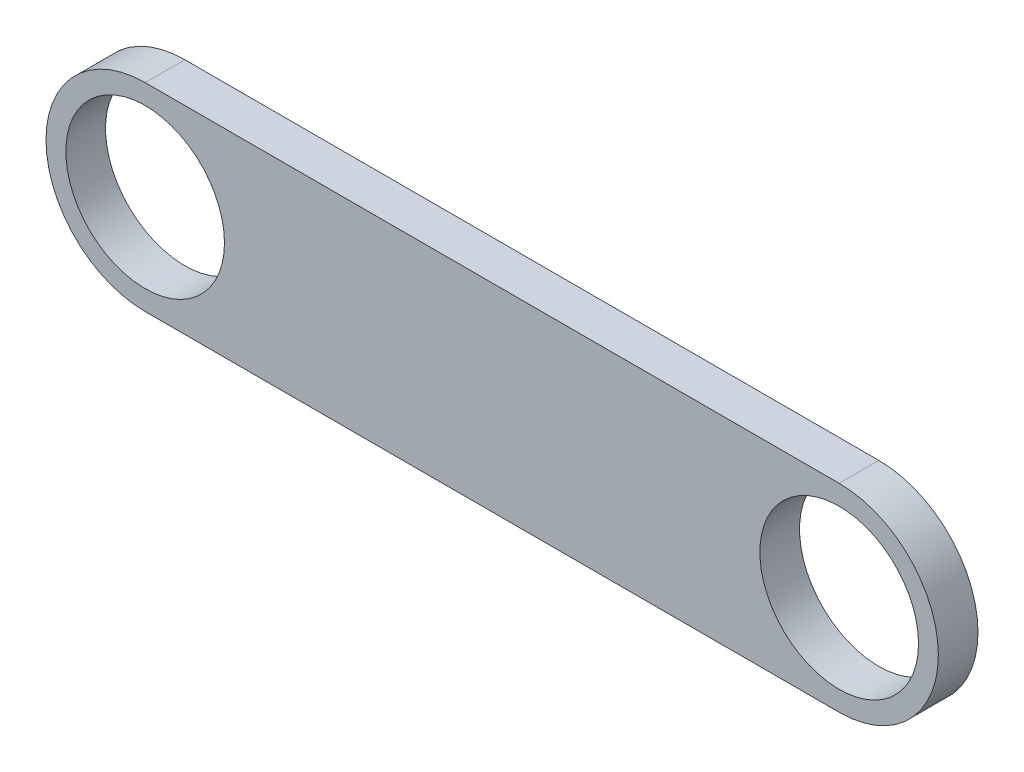
ISO-10303-21;
HEADER;
FILE_DESCRIPTION(('STEP AP214'),'2;1');
FILE_NAME('part.step','',(''),(''),'','','');
FILE_SCHEMA(('AUTOMOTIVE_DESIGN { 1 0 10303 214 1 1 1 1 }'));
ENDSEC;
DATA;
#1=APPLICATION_CONTEXT('core data for automotive mechanical design processes');
#2=APPLICATION_PROTOCOL_DEFINITION('international standard','automotive_design',2000,#1);
#3=PRODUCT_CONTEXT('',#1,'mechanical');
#4=PRODUCT('Part','Part','',(#3));
#5=PRODUCT_RELATED_PRODUCT_CATEGORY('part','',(#4));
#6=PRODUCT_DEFINITION_FORMATION('','',#4);
#7=PRODUCT_DEFINITION_CONTEXT('part definition',#1,'design');
#8=PRODUCT_DEFINITION('design','',#6,#7);
#9=PRODUCT_DEFINITION_SHAPE('','',#8);
#10=(LENGTH_UNIT() NAMED_UNIT(*) SI_UNIT(.MILLI.,.METRE.));
#11=(NAMED_UNIT(*) PLANE_ANGLE_UNIT() SI_UNIT($,.RADIAN.));
#12=(NAMED_UNIT(*) SI_UNIT($,.STERADIAN.) SOLID_ANGLE_UNIT());
#13=UNCERTAINTY_MEASURE_WITH_UNIT(LENGTH_MEASURE(1.E-05),#10,'distance_accuracy_value','');
#14=(GEOMETRIC_REPRESENTATION_CONTEXT(3) GLOBAL_UNCERTAINTY_ASSIGNED_CONTEXT((#13)) GLOBAL_UNIT_ASSIGNED_CONTEXT((#10,
#11,#12)) REPRESENTATION_CONTEXT('',''));
#15=CARTESIAN_POINT('',(0.,0.,0.));
#16=DIRECTION('',(0.,0.,1.));
#17=DIRECTION('',(1.,0.,0.));
#18=AXIS2_PLACEMENT_3D('',#15,#16,#17);
#19=CARTESIAN_POINT('',(6.5164097109E-07,-1.3736026467E-07,2.));
#20=DIRECTION('',(0.,0.,1.));
#21=DIRECTION('',(1.,0.,0.));
#22=AXIS2_PLACEMENT_3D('',#19,#20,#21);
#23=PLANE('',#22);
#24=CARTESIAN_POINT('',(-17.5,0.,2.));
#25=DIRECTION('',(0.,0.,1.));
#26=DIRECTION('',(1.,0.,0.));
#27=AXIS2_PLACEMENT_3D('',#24,#25,#26);
#28=CIRCLE('',#27,4.);
#29=CARTESIAN_POINT('',(-13.5,0.,2.));
#30=VERTEX_POINT('',#29);
#31=EDGE_CURVE('E125',#30,#30,#28,.T.);
#32=ORIENTED_EDGE('',*,*,#31,.F.);
#33=EDGE_LOOP('',(#32));
#34=FACE_BOUND('',#33,.T.);
#35=CARTESIAN_POINT('',(17.5000129164835,2.49331805202146E-11,2.));
#36=DIRECTION('',(0.,0.,1.));
#37=DIRECTION('',(1.,0.,0.));
#38=AXIS2_PLACEMENT_3D('',#35,#36,#37);
#39=CIRCLE('',#38,4.);
#40=CARTESIAN_POINT('',(21.5000129164835,2.49331805202146E-11,2.));
#41=VERTEX_POINT('',#40);
#42=EDGE_CURVE('E134',#41,#41,#39,.T.);
#43=ORIENTED_EDGE('',*,*,#42,.F.);
#44=EDGE_LOOP('',(#43));
#45=FACE_BOUND('',#44,.T.);
#46=DIRECTION('',(1.,0.,0.));
#47=VECTOR('',#46,1.);
#48=CARTESIAN_POINT('',(-17.5,-5.,2.));
#49=LINE('',#48,#47);
#50=CARTESIAN_POINT('',(-17.5,-5.,2.));
#51=VERTEX_POINT('',#50);
#52=CARTESIAN_POINT('',(17.500025832967,-4.999999999967,2.));
#53=VERTEX_POINT('',#52);
#54=EDGE_CURVE('E101',#51,#53,#49,.T.);
#55=ORIENTED_EDGE('',*,*,#54,.T.);
#56=CARTESIAN_POINT('',(17.5,0.,2.));
#57=DIRECTION('',(0.,0.,1.));
#58=DIRECTION('',(1.,0.,0.));
#59=AXIS2_PLACEMENT_3D('',#56,#57,#58);
#60=CIRCLE('',#59,5.);
#61=CARTESIAN_POINT('',(17.5,5.,2.));
#62=VERTEX_POINT('',#61);
#63=EDGE_CURVE('E99',#53,#62,#60,.T.);
#64=ORIENTED_EDGE('',*,*,#63,.T.);
#65=DIRECTION('',(-1.,0.,0.));
#66=VECTOR('',#65,1.);
#67=CARTESIAN_POINT('',(17.5,5.,2.));
#68=LINE('',#67,#66);
#69=CARTESIAN_POINT('',(-17.5,5.,2.));
#70=VERTEX_POINT('',#69);
#71=EDGE_CURVE('E88',#62,#70,#68,.T.);
#72=ORIENTED_EDGE('',*,*,#71,.T.);
#73=CARTESIAN_POINT('',(-17.5,0.,2.));
#74=DIRECTION('',(0.,0.,1.));
#75=DIRECTION('',(1.,0.,0.));
#76=AXIS2_PLACEMENT_3D('',#73,#74,#75);
#77=CIRCLE('',#76,5.);
#78=EDGE_CURVE('E11',#70,#51,#77,.T.);
#79=ORIENTED_EDGE('',*,*,#78,.T.);
#80=EDGE_LOOP('',(#55,#64,#72,#79));
#81=FACE_BOUND('',#80,.T.);
#82=ADVANCED_FACE('F50',(#34,#45,#81),#23,.T.);
#83=CARTESIAN_POINT('',(6.5164097109E-07,-1.3736026467E-07,0.));
#84=DIRECTION('',(0.,0.,1.));
#85=DIRECTION('',(1.,0.,0.));
#86=AXIS2_PLACEMENT_3D('',#83,#84,#85);
#87=PLANE('',#86);
#88=CARTESIAN_POINT('',(-17.5,0.,0.));
#89=DIRECTION('',(0.,0.,1.));
#90=DIRECTION('',(1.,0.,0.));
#91=AXIS2_PLACEMENT_3D('',#88,#89,#90);
#92=CIRCLE('',#91,4.);
#93=CARTESIAN_POINT('',(-13.5,0.,0.));
#94=VERTEX_POINT('',#93);
#95=EDGE_CURVE('E120',#94,#94,#92,.T.);
#96=ORIENTED_EDGE('',*,*,#95,.T.);
#97=EDGE_LOOP('',(#96));
#98=FACE_BOUND('',#97,.T.);
#99=CARTESIAN_POINT('',(17.5000129164835,2.49331805202146E-11,0.));
#100=DIRECTION('',(0.,0.,1.));
#101=DIRECTION('',(1.,0.,0.));
#102=AXIS2_PLACEMENT_3D('',#99,#100,#101);
#103=CIRCLE('',#102,4.);
#104=CARTESIAN_POINT('',(21.5000129164835,2.49331805202146E-11,0.));
#105=VERTEX_POINT('',#104);
#106=EDGE_CURVE('E130',#105,#105,#103,.T.);
#107=ORIENTED_EDGE('',*,*,#106,.T.);
#108=EDGE_LOOP('',(#107));
#109=FACE_BOUND('',#108,.T.);
#110=CARTESIAN_POINT('',(-17.5,0.,0.));
#111=DIRECTION('',(0.,0.,1.));
#112=DIRECTION('',(1.,0.,0.));
#113=AXIS2_PLACEMENT_3D('',#110,#111,#112);
#114=CIRCLE('',#113,5.);
#115=CARTESIAN_POINT('',(-17.5,5.,0.));
#116=VERTEX_POINT('',#115);
#117=CARTESIAN_POINT('',(-17.5,-5.,0.));
#118=VERTEX_POINT('',#117);
#119=EDGE_CURVE('E60',#116,#118,#114,.T.);
#120=ORIENTED_EDGE('',*,*,#119,.F.);
#121=DIRECTION('',(-1.,0.,0.));
#122=VECTOR('',#121,1.);
#123=CARTESIAN_POINT('',(17.5,5.,0.));
#124=LINE('',#123,#122);
#125=CARTESIAN_POINT('',(17.5,5.,0.));
#126=VERTEX_POINT('',#125);
#127=EDGE_CURVE('E54',#126,#116,#124,.T.);
#128=ORIENTED_EDGE('',*,*,#127,.F.);
#129=CARTESIAN_POINT('',(17.5,0.,0.));
#130=DIRECTION('',(0.,0.,1.));
#131=DIRECTION('',(1.,0.,0.));
#132=AXIS2_PLACEMENT_3D('',#129,#130,#131);
#133=CIRCLE('',#132,5.);
#134=CARTESIAN_POINT('',(17.500025832967,-4.999999999967,0.));
#135=VERTEX_POINT('',#134);
#136=EDGE_CURVE('E107',#135,#126,#133,.T.);
#137=ORIENTED_EDGE('',*,*,#136,.F.);
#138=DIRECTION('',(1.,0.,0.));
#139=VECTOR('',#138,1.);
#140=CARTESIAN_POINT('',(-17.5,-5.,0.));
#141=LINE('',#140,#139);
#142=EDGE_CURVE('E118',#118,#135,#141,.T.);
#143=ORIENTED_EDGE('',*,*,#142,.F.);
#144=EDGE_LOOP('',(#120,#128,#137,#143));
#145=FACE_BOUND('',#144,.T.);
#146=ADVANCED_FACE('F141',(#98,#109,#145),#87,.F.);
#147=CARTESIAN_POINT('',(-17.5,0.,0.));
#148=DIRECTION('',(0.,0.,-1.));
#149=DIRECTION('',(1.,0.,0.));
#150=AXIS2_PLACEMENT_3D('',#147,#148,#149);
#151=CYLINDRICAL_SURFACE('',#150,5.);
#152=ORIENTED_EDGE('',*,*,#119,.T.);
#153=DIRECTION('',(0.,0.,1.));
#154=VECTOR('',#153,1.);
#155=CARTESIAN_POINT('',(-17.5,-5.,0.));
#156=LINE('',#155,#154);
#157=EDGE_CURVE('E109',#118,#51,#156,.T.);
#158=ORIENTED_EDGE('',*,*,#157,.T.);
#159=ORIENTED_EDGE('',*,*,#78,.F.);
#160=DIRECTION('',(0.,0.,1.));
#161=VECTOR('',#160,1.);
#162=CARTESIAN_POINT('',(-17.5,5.,0.));
#163=LINE('',#162,#161);
#164=EDGE_CURVE('E95',#116,#70,#163,.T.);
#165=ORIENTED_EDGE('',*,*,#164,.F.);
#166=EDGE_LOOP('',(#152,#158,#159,#165));
#167=FACE_BOUND('',#166,.T.);
#168=ADVANCED_FACE('F52',(#167),#151,.T.);
#169=CARTESIAN_POINT('',(17.5,5.,0.));
#170=DIRECTION('',(0.,-1.,0.));
#171=DIRECTION('',(0.,0.,-1.));
#172=AXIS2_PLACEMENT_3D('',#169,#170,#171);
#173=PLANE('',#172);
#174=ORIENTED_EDGE('',*,*,#127,.T.);
#175=ORIENTED_EDGE('',*,*,#164,.T.);
#176=ORIENTED_EDGE('',*,*,#71,.F.);
#177=DIRECTION('',(0.,0.,1.));
#178=VECTOR('',#177,1.);
#179=CARTESIAN_POINT('',(17.5,5.,0.));
#180=LINE('',#179,#178);
#181=EDGE_CURVE('E93',#126,#62,#180,.T.);
#182=ORIENTED_EDGE('',*,*,#181,.F.);
#183=EDGE_LOOP('',(#174,#175,#176,#182));
#184=FACE_BOUND('',#183,.T.);
#185=ADVANCED_FACE('F91',(#184),#173,.F.);
#186=CARTESIAN_POINT('',(17.5,0.,0.));
#187=DIRECTION('',(0.,0.,-1.));
#188=DIRECTION('',(1.,0.,0.));
#189=AXIS2_PLACEMENT_3D('',#186,#187,#188);
#190=CYLINDRICAL_SURFACE('',#189,5.);
#191=ORIENTED_EDGE('',*,*,#136,.T.);
#192=ORIENTED_EDGE('',*,*,#181,.T.);
#193=ORIENTED_EDGE('',*,*,#63,.F.);
#194=DIRECTION('',(0.,0.,1.));
#195=VECTOR('',#194,1.);
#196=CARTESIAN_POINT('',(17.500025832967,-4.999999999967,0.));
#197=LINE('',#196,#195);
#198=EDGE_CURVE('E116',#135,#53,#197,.T.);
#199=ORIENTED_EDGE('',*,*,#198,.F.);
#200=EDGE_LOOP('',(#191,#192,#193,#199));
#201=FACE_BOUND('',#200,.T.);
#202=ADVANCED_FACE('F106',(#201),#190,.T.);
#203=CARTESIAN_POINT('',(-17.5,-5.,0.));
#204=DIRECTION('',(0.,1.,0.));
#205=DIRECTION('',(1.,0.,0.));
#206=AXIS2_PLACEMENT_3D('',#203,#204,#205);
#207=PLANE('',#206);
#208=ORIENTED_EDGE('',*,*,#142,.T.);
#209=ORIENTED_EDGE('',*,*,#198,.T.);
#210=ORIENTED_EDGE('',*,*,#54,.F.);
#211=ORIENTED_EDGE('',*,*,#157,.F.);
#212=EDGE_LOOP('',(#208,#209,#210,#211));
#213=FACE_BOUND('',#212,.T.);
#214=ADVANCED_FACE('F151',(#213),#207,.F.);
#215=CARTESIAN_POINT('',(17.5000129164835,2.49331805202146E-11,0.));
#216=DIRECTION('',(0.,0.,1.));
#217=DIRECTION('',(1.,0.,0.));
#218=AXIS2_PLACEMENT_3D('',#215,#216,#217);
#219=CYLINDRICAL_SURFACE('',#218,4.);
#220=ORIENTED_EDGE('',*,*,#106,.F.);
#221=EDGE_LOOP('',(#220));
#222=FACE_BOUND('',#221,.T.);
#223=ORIENTED_EDGE('',*,*,#42,.T.);
#224=EDGE_LOOP('',(#223));
#225=FACE_BOUND('',#224,.T.);
#226=ADVANCED_FACE('F138',(#222,#225),#219,.F.);
#227=CARTESIAN_POINT('',(-17.5,0.,0.));
#228=DIRECTION('',(0.,0.,1.));
#229=DIRECTION('',(1.,0.,0.));
#230=AXIS2_PLACEMENT_3D('',#227,#228,#229);
#231=CYLINDRICAL_SURFACE('',#230,4.);
#232=ORIENTED_EDGE('',*,*,#95,.F.);
#233=EDGE_LOOP('',(#232));
#234=FACE_BOUND('',#233,.T.);
#235=ORIENTED_EDGE('',*,*,#31,.T.);
#236=EDGE_LOOP('',(#235));
#237=FACE_BOUND('',#236,.T.);
#238=ADVANCED_FACE('F165',(#234,#237),#231,.F.);
#239=CLOSED_SHELL('',(#82,#146,#168,#185,#202,#214,#226,#238));
#240=MANIFOLD_SOLID_BREP('B2',#239);
#241=ADVANCED_BREP_SHAPE_REPRESENTATION('',(#18,#240),#14);
#242=SHAPE_DEFINITION_REPRESENTATION(#9,#241);
ENDSEC;
END-ISO-10303-21;
